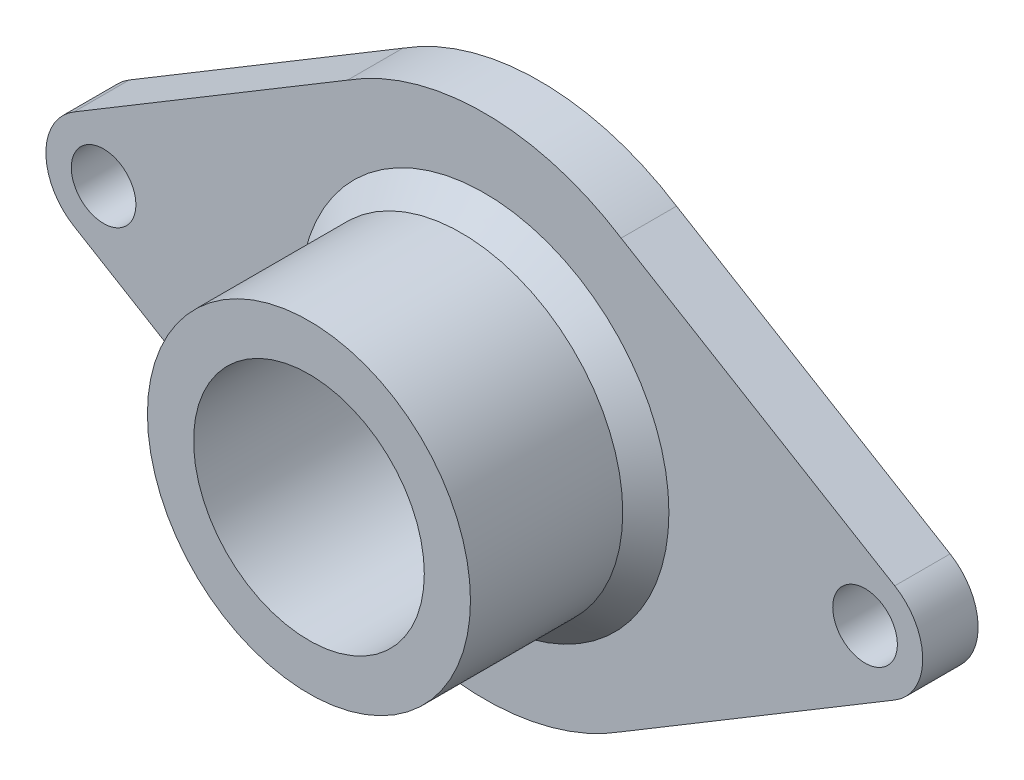
ISO-10303-21;
HEADER;
FILE_DESCRIPTION(('STEP AP214'),'2;1');
FILE_NAME('part.step','',(''),(''),'','','');
FILE_SCHEMA(('AUTOMOTIVE_DESIGN { 1 0 10303 214 1 1 1 1 }'));
ENDSEC;
DATA;
#1=APPLICATION_CONTEXT('core data for automotive mechanical design processes');
#2=APPLICATION_PROTOCOL_DEFINITION('international standard','automotive_design',2000,#1);
#3=PRODUCT_CONTEXT('',#1,'mechanical');
#4=PRODUCT('Part','Part','',(#3));
#5=PRODUCT_RELATED_PRODUCT_CATEGORY('part','',(#4));
#6=PRODUCT_DEFINITION_FORMATION('','',#4);
#7=PRODUCT_DEFINITION_CONTEXT('part definition',#1,'design');
#8=PRODUCT_DEFINITION('design','',#6,#7);
#9=PRODUCT_DEFINITION_SHAPE('','',#8);
#10=(LENGTH_UNIT() NAMED_UNIT(*) SI_UNIT(.MILLI.,.METRE.));
#11=(NAMED_UNIT(*) PLANE_ANGLE_UNIT() SI_UNIT($,.RADIAN.));
#12=(NAMED_UNIT(*) SI_UNIT($,.STERADIAN.) SOLID_ANGLE_UNIT());
#13=UNCERTAINTY_MEASURE_WITH_UNIT(LENGTH_MEASURE(1.E-05),#10,'distance_accuracy_value','');
#14=(GEOMETRIC_REPRESENTATION_CONTEXT(3) GLOBAL_UNCERTAINTY_ASSIGNED_CONTEXT((#13)) GLOBAL_UNIT_ASSIGNED_CONTEXT((#10,
#11,#12)) REPRESENTATION_CONTEXT('',''));
#15=CARTESIAN_POINT('',(0.,0.,0.));
#16=DIRECTION('',(0.,0.,1.));
#17=DIRECTION('',(1.,0.,0.));
#18=AXIS2_PLACEMENT_3D('',#15,#16,#17);
#19=CARTESIAN_POINT('',(0.,0.,50.));
#20=DIRECTION('',(0.,0.,1.));
#21=DIRECTION('',(1.,0.,0.));
#22=AXIS2_PLACEMENT_3D('',#19,#20,#21);
#23=PLANE('',#22);
#24=CARTESIAN_POINT('',(0.,0.,50.));
#25=DIRECTION('',(0.,0.,1.));
#26=DIRECTION('',(1.,0.,0.));
#27=AXIS2_PLACEMENT_3D('',#24,#25,#26);
#28=CIRCLE('',#27,35.);
#29=CARTESIAN_POINT('',(35.,0.,50.));
#30=VERTEX_POINT('',#29);
#31=EDGE_CURVE('E165',#30,#30,#28,.T.);
#32=ORIENTED_EDGE('',*,*,#31,.T.);
#33=EDGE_LOOP('',(#32));
#34=FACE_BOUND('',#33,.T.);
#35=CARTESIAN_POINT('',(0.,0.,50.));
#36=DIRECTION('',(0.,0.,1.));
#37=DIRECTION('',(1.,0.,0.));
#38=AXIS2_PLACEMENT_3D('',#35,#36,#37);
#39=CIRCLE('',#38,25.);
#40=CARTESIAN_POINT('',(25.,0.,50.));
#41=VERTEX_POINT('',#40);
#42=EDGE_CURVE('E162',#41,#41,#39,.T.);
#43=ORIENTED_EDGE('',*,*,#42,.F.);
#44=EDGE_LOOP('',(#43));
#45=FACE_BOUND('',#44,.T.);
#46=ADVANCED_FACE('F33',(#34,#45),#23,.T.);
#47=CARTESIAN_POINT('',(0.,0.,0.));
#48=DIRECTION('',(0.,0.,1.));
#49=DIRECTION('',(1.,0.,0.));
#50=AXIS2_PLACEMENT_3D('',#47,#48,#49);
#51=PLANE('',#50);
#52=CARTESIAN_POINT('',(82.5000000001048,8.88178419700125E-13,0.));
#53=DIRECTION('',(0.,0.,-1.));
#54=DIRECTION('',(-1.,0.,0.));
#55=AXIS2_PLACEMENT_3D('',#52,#53,#54);
#56=CIRCLE('',#55,7.);
#57=CARTESIAN_POINT('',(75.5000000001048,8.88178419700125E-13,0.));
#58=VERTEX_POINT('',#57);
#59=EDGE_CURVE('E355',#58,#58,#56,.T.);
#60=ORIENTED_EDGE('',*,*,#59,.F.);
#61=EDGE_LOOP('',(#60));
#62=FACE_BOUND('',#61,.T.);
#63=CARTESIAN_POINT('',(-82.5000000000336,5.24857934891543E-11,0.));
#64=DIRECTION('',(0.,0.,-1.));
#65=DIRECTION('',(-1.,0.,0.));
#66=AXIS2_PLACEMENT_3D('',#63,#64,#65);
#67=CIRCLE('',#66,7.);
#68=CARTESIAN_POINT('',(-89.5000000000336,5.24857934891543E-11,0.));
#69=VERTEX_POINT('',#68);
#70=EDGE_CURVE('E349',#69,#69,#67,.T.);
#71=ORIENTED_EDGE('',*,*,#70,.F.);
#72=EDGE_LOOP('',(#71));
#73=FACE_BOUND('',#72,.T.);
#74=CARTESIAN_POINT('',(0.,0.,0.));
#75=DIRECTION('',(0.,0.,1.));
#76=DIRECTION('',(1.,0.,0.));
#77=AXIS2_PLACEMENT_3D('',#74,#75,#76);
#78=CIRCLE('',#77,25.);
#79=CARTESIAN_POINT('',(25.,0.,0.));
#80=VERTEX_POINT('',#79);
#81=EDGE_CURVE('E161',#80,#80,#78,.T.);
#82=ORIENTED_EDGE('',*,*,#81,.T.);
#83=EDGE_LOOP('',(#82));
#84=FACE_BOUND('',#83,.T.);
#85=CARTESIAN_POINT('',(0.,0.,0.));
#86=DIRECTION('',(0.,0.,1.));
#87=DIRECTION('',(1.,0.,0.));
#88=AXIS2_PLACEMENT_3D('',#85,#86,#87);
#89=CIRCLE('',#88,55.);
#90=CARTESIAN_POINT('',(-29.647715243353,-46.3250793938775,0.));
#91=VERTEX_POINT('',#90);
#92=CARTESIAN_POINT('',(29.647715243353,-46.3250793938775,0.));
#93=VERTEX_POINT('',#92);
#94=EDGE_CURVE('E131',#91,#93,#89,.T.);
#95=ORIENTED_EDGE('',*,*,#94,.F.);
#96=DIRECTION('',(0.857261085832515,-0.514881958042091,0.));
#97=VECTOR('',#96,1.);
#98=CARTESIAN_POINT('',(-29.647715243353,-46.3250793938775,0.));
#99=LINE('',#98,#97);
#100=CARTESIAN_POINT('',(-88.936024475546,-10.7157635728622,0.));
#101=VERTEX_POINT('',#100);
#102=EDGE_CURVE('E85',#101,#91,#99,.T.);
#103=ORIENTED_EDGE('',*,*,#102,.F.);
#104=CARTESIAN_POINT('',(-82.5000000000336,5.24857934891543E-11,0.));
#105=DIRECTION('',(0.,0.,1.));
#106=DIRECTION('',(1.,0.,0.));
#107=AXIS2_PLACEMENT_3D('',#104,#105,#106);
#108=CIRCLE('',#107,12.5);
#109=CARTESIAN_POINT('',(-88.936024475546,10.7157635729672,0.));
#110=VERTEX_POINT('',#109);
#111=EDGE_CURVE('E79',#110,#101,#108,.T.);
#112=ORIENTED_EDGE('',*,*,#111,.F.);
#113=DIRECTION('',(-0.857261085833173,-0.514881958040995,0.));
#114=VECTOR('',#113,1.);
#115=CARTESIAN_POINT('',(-29.6477152433058,46.3250793939077,0.));
#116=LINE('',#115,#114);
#117=CARTESIAN_POINT('',(-29.6477152433058,46.3250793939077,0.));
#118=VERTEX_POINT('',#117);
#119=EDGE_CURVE('E121',#118,#110,#116,.T.);
#120=ORIENTED_EDGE('',*,*,#119,.F.);
#121=CARTESIAN_POINT('',(0.,0.,0.));
#122=DIRECTION('',(0.,0.,1.));
#123=DIRECTION('',(1.,0.,0.));
#124=AXIS2_PLACEMENT_3D('',#121,#122,#123);
#125=CIRCLE('',#124,55.0000000000009);
#126=CARTESIAN_POINT('',(29.6477152433086,46.325079393907,0.));
#127=VERTEX_POINT('',#126);
#128=EDGE_CURVE('E141',#127,#118,#125,.T.);
#129=ORIENTED_EDGE('',*,*,#128,.F.);
#130=DIRECTION('',(-0.857261085833173,0.514881958040996,0.));
#131=VECTOR('',#130,1.);
#132=CARTESIAN_POINT('',(29.6477152433091,46.3250793939078,0.));
#133=LINE('',#132,#131);
#134=CARTESIAN_POINT('',(88.9360244755493,10.7157635729672,0.));
#135=VERTEX_POINT('',#134);
#136=EDGE_CURVE('E139',#135,#127,#133,.T.);
#137=ORIENTED_EDGE('',*,*,#136,.F.);
#138=CARTESIAN_POINT('',(82.5000000001048,8.88178419700125E-13,0.));
#139=DIRECTION('',(0.,0.,1.));
#140=DIRECTION('',(-1.,0.,0.));
#141=AXIS2_PLACEMENT_3D('',#138,#139,#140);
#142=CIRCLE('',#141,12.5000000000084);
#143=CARTESIAN_POINT('',(88.9360244755942,-10.7157635729374,0.));
#144=VERTEX_POINT('',#143);
#145=EDGE_CURVE('E137',#144,#135,#142,.T.);
#146=ORIENTED_EDGE('',*,*,#145,.F.);
#147=DIRECTION('',(0.857261085833173,0.514881958040996,0.));
#148=VECTOR('',#147,1.);
#149=CARTESIAN_POINT('',(29.647715243353,-46.3250793938775,0.));
#150=LINE('',#149,#148);
#151=EDGE_CURVE('E134',#93,#144,#150,.T.);
#152=ORIENTED_EDGE('',*,*,#151,.F.);
#153=EDGE_LOOP('',(#95,#103,#112,#120,#129,#137,#146,#152));
#154=FACE_BOUND('',#153,.T.);
#155=ADVANCED_FACE('F186',(#62,#73,#84,#154),#51,.F.);
#156=CARTESIAN_POINT('',(0.,0.,50.));
#157=DIRECTION('',(0.,0.,-1.));
#158=DIRECTION('',(-1.,0.,0.));
#159=AXIS2_PLACEMENT_3D('',#156,#157,#158);
#160=CYLINDRICAL_SURFACE('',#159,35.);
#161=CARTESIAN_POINT('',(0.,0.,17.));
#162=DIRECTION('',(0.,0.,1.));
#163=DIRECTION('',(1.,0.,0.));
#164=AXIS2_PLACEMENT_3D('',#161,#162,#163);
#165=CIRCLE('',#164,35.);
#166=CARTESIAN_POINT('',(35.,0.,17.));
#167=VERTEX_POINT('',#166);
#168=EDGE_CURVE('E42',#167,#167,#165,.T.);
#169=ORIENTED_EDGE('',*,*,#168,.T.);
#170=EDGE_LOOP('',(#169));
#171=FACE_BOUND('',#170,.T.);
#172=ORIENTED_EDGE('',*,*,#31,.F.);
#173=EDGE_LOOP('',(#172));
#174=FACE_BOUND('',#173,.T.);
#175=ADVANCED_FACE('F172',(#171,#174),#160,.T.);
#176=CARTESIAN_POINT('',(0.,0.,50.));
#177=DIRECTION('',(0.,0.,-1.));
#178=DIRECTION('',(-1.,0.,0.));
#179=AXIS2_PLACEMENT_3D('',#176,#177,#178);
#180=CYLINDRICAL_SURFACE('',#179,25.);
#181=ORIENTED_EDGE('',*,*,#42,.T.);
#182=EDGE_LOOP('',(#181));
#183=FACE_BOUND('',#182,.T.);
#184=ORIENTED_EDGE('',*,*,#81,.F.);
#185=EDGE_LOOP('',(#184));
#186=FACE_BOUND('',#185,.T.);
#187=ADVANCED_FACE('F196',(#183,#186),#180,.F.);
#188=CARTESIAN_POINT('',(0.,0.,12.));
#189=DIRECTION('',(0.,0.,1.));
#190=DIRECTION('',(1.,0.,0.));
#191=AXIS2_PLACEMENT_3D('',#188,#189,#190);
#192=PLANE('',#191);
#193=CARTESIAN_POINT('',(0.,0.,12.));
#194=DIRECTION('',(0.,0.,1.));
#195=DIRECTION('',(1.,0.,0.));
#196=AXIS2_PLACEMENT_3D('',#193,#194,#195);
#197=CIRCLE('',#196,40.);
#198=CARTESIAN_POINT('',(40.,0.,12.));
#199=VERTEX_POINT('',#198);
#200=EDGE_CURVE('E11',#199,#199,#197,.F.);
#201=ORIENTED_EDGE('',*,*,#200,.T.);
#202=EDGE_LOOP('',(#201));
#203=FACE_BOUND('',#202,.T.);
#204=CARTESIAN_POINT('',(82.5000000001048,8.88178419700125E-13,12.));
#205=DIRECTION('',(0.,0.,-1.));
#206=DIRECTION('',(-1.,0.,0.));
#207=AXIS2_PLACEMENT_3D('',#204,#205,#206);
#208=CIRCLE('',#207,7.);
#209=CARTESIAN_POINT('',(75.5000000001048,8.88178419700125E-13,12.));
#210=VERTEX_POINT('',#209);
#211=EDGE_CURVE('E135',#210,#210,#208,.T.);
#212=ORIENTED_EDGE('',*,*,#211,.T.);
#213=EDGE_LOOP('',(#212));
#214=FACE_BOUND('',#213,.T.);
#215=CARTESIAN_POINT('',(-82.5000000000336,5.24857934891543E-11,12.));
#216=DIRECTION('',(0.,0.,-1.));
#217=DIRECTION('',(-1.,0.,0.));
#218=AXIS2_PLACEMENT_3D('',#215,#216,#217);
#219=CIRCLE('',#218,7.);
#220=CARTESIAN_POINT('',(-89.5000000000336,5.24857934891543E-11,12.));
#221=VERTEX_POINT('',#220);
#222=EDGE_CURVE('E352',#221,#221,#219,.T.);
#223=ORIENTED_EDGE('',*,*,#222,.T.);
#224=EDGE_LOOP('',(#223));
#225=FACE_BOUND('',#224,.T.);
#226=CARTESIAN_POINT('',(0.,0.,12.));
#227=DIRECTION('',(0.,0.,1.));
#228=DIRECTION('',(1.,0.,0.));
#229=AXIS2_PLACEMENT_3D('',#226,#227,#228);
#230=CIRCLE('',#229,55.);
#231=CARTESIAN_POINT('',(-29.647715243353,-46.3250793938775,12.));
#232=VERTEX_POINT('',#231);
#233=CARTESIAN_POINT('',(29.647715243353,-46.3250793938775,12.));
#234=VERTEX_POINT('',#233);
#235=EDGE_CURVE('E146',#232,#234,#230,.T.);
#236=ORIENTED_EDGE('',*,*,#235,.T.);
#237=DIRECTION('',(0.857261085833173,0.514881958040996,0.));
#238=VECTOR('',#237,1.);
#239=CARTESIAN_POINT('',(29.647715243353,-46.3250793938775,12.));
#240=LINE('',#239,#238);
#241=CARTESIAN_POINT('',(88.9360244755942,-10.7157635729374,12.));
#242=VERTEX_POINT('',#241);
#243=EDGE_CURVE('E94',#234,#242,#240,.T.);
#244=ORIENTED_EDGE('',*,*,#243,.T.);
#245=CARTESIAN_POINT('',(82.5000000001048,8.88178419700125E-13,12.));
#246=DIRECTION('',(0.,0.,1.));
#247=DIRECTION('',(-1.,0.,0.));
#248=AXIS2_PLACEMENT_3D('',#245,#246,#247);
#249=CIRCLE('',#248,12.5000000000084);
#250=CARTESIAN_POINT('',(88.9360244755493,10.7157635729672,12.));
#251=VERTEX_POINT('',#250);
#252=EDGE_CURVE('E338',#242,#251,#249,.T.);
#253=ORIENTED_EDGE('',*,*,#252,.T.);
#254=DIRECTION('',(-0.857261085833173,0.514881958040996,0.));
#255=VECTOR('',#254,1.);
#256=CARTESIAN_POINT('',(29.6477152433091,46.3250793939078,12.));
#257=LINE('',#256,#255);
#258=CARTESIAN_POINT('',(29.6477152433086,46.325079393907,12.));
#259=VERTEX_POINT('',#258);
#260=EDGE_CURVE('E343',#251,#259,#257,.T.);
#261=ORIENTED_EDGE('',*,*,#260,.T.);
#262=CARTESIAN_POINT('',(0.,0.,12.));
#263=DIRECTION('',(0.,0.,1.));
#264=DIRECTION('',(1.,0.,0.));
#265=AXIS2_PLACEMENT_3D('',#262,#263,#264);
#266=CIRCLE('',#265,55.0000000000009);
#267=CARTESIAN_POINT('',(-29.6477152433058,46.3250793939077,12.));
#268=VERTEX_POINT('',#267);
#269=EDGE_CURVE('E113',#259,#268,#266,.T.);
#270=ORIENTED_EDGE('',*,*,#269,.T.);
#271=DIRECTION('',(-0.857261085833173,-0.514881958040995,0.));
#272=VECTOR('',#271,1.);
#273=CARTESIAN_POINT('',(-29.6477152433058,46.3250793939077,12.));
#274=LINE('',#273,#272);
#275=CARTESIAN_POINT('',(-88.936024475546,10.7157635729672,12.));
#276=VERTEX_POINT('',#275);
#277=EDGE_CURVE('E107',#268,#276,#274,.T.);
#278=ORIENTED_EDGE('',*,*,#277,.T.);
#279=CARTESIAN_POINT('',(-82.5000000000336,5.24857934891543E-11,12.));
#280=DIRECTION('',(0.,0.,1.));
#281=DIRECTION('',(1.,0.,0.));
#282=AXIS2_PLACEMENT_3D('',#279,#280,#281);
#283=CIRCLE('',#282,12.5);
#284=CARTESIAN_POINT('',(-88.936024475546,-10.7157635728622,12.));
#285=VERTEX_POINT('',#284);
#286=EDGE_CURVE('E111',#276,#285,#283,.T.);
#287=ORIENTED_EDGE('',*,*,#286,.T.);
#288=DIRECTION('',(0.857261085832515,-0.514881958042091,0.));
#289=VECTOR('',#288,1.);
#290=CARTESIAN_POINT('',(-29.647715243353,-46.3250793938775,12.));
#291=LINE('',#290,#289);
#292=EDGE_CURVE('E50',#285,#232,#291,.T.);
#293=ORIENTED_EDGE('',*,*,#292,.T.);
#294=EDGE_LOOP('',(#236,#244,#253,#261,#270,#278,#287,#293));
#295=FACE_BOUND('',#294,.T.);
#296=ADVANCED_FACE('F109',(#203,#214,#225,#295),#192,.T.);
#297=CARTESIAN_POINT('',(0.,0.,12.));
#298=DIRECTION('',(0.,0.,-1.));
#299=DIRECTION('',(-1.,0.,0.));
#300=AXIS2_PLACEMENT_3D('',#297,#298,#299);
#301=CYLINDRICAL_SURFACE('',#300,55.);
#302=ORIENTED_EDGE('',*,*,#94,.T.);
#303=DIRECTION('',(0.,0.,-1.));
#304=VECTOR('',#303,1.);
#305=CARTESIAN_POINT('',(29.647715243353,-46.3250793938775,12.));
#306=LINE('',#305,#304);
#307=EDGE_CURVE('E159',#234,#93,#306,.T.);
#308=ORIENTED_EDGE('',*,*,#307,.F.);
#309=ORIENTED_EDGE('',*,*,#235,.F.);
#310=DIRECTION('',(0.,0.,-1.));
#311=VECTOR('',#310,1.);
#312=CARTESIAN_POINT('',(-29.647715243353,-46.3250793938775,12.));
#313=LINE('',#312,#311);
#314=EDGE_CURVE('E127',#232,#91,#313,.T.);
#315=ORIENTED_EDGE('',*,*,#314,.T.);
#316=EDGE_LOOP('',(#302,#308,#309,#315));
#317=FACE_BOUND('',#316,.T.);
#318=ADVANCED_FACE('F208',(#317),#301,.T.);
#319=CARTESIAN_POINT('',(29.647715243353,-46.3250793938775,12.));
#320=DIRECTION('',(-0.514881958040995,0.857261085833173,0.));
#321=DIRECTION('',(-0.857261085833173,-0.514881958040996,0.));
#322=AXIS2_PLACEMENT_3D('',#319,#320,#321);
#323=PLANE('',#322);
#324=ORIENTED_EDGE('',*,*,#151,.T.);
#325=DIRECTION('',(0.,0.,-1.));
#326=VECTOR('',#325,1.);
#327=CARTESIAN_POINT('',(88.9360244755942,-10.7157635729374,12.));
#328=LINE('',#327,#326);
#329=EDGE_CURVE('E156',#242,#144,#328,.T.);
#330=ORIENTED_EDGE('',*,*,#329,.F.);
#331=ORIENTED_EDGE('',*,*,#243,.F.);
#332=ORIENTED_EDGE('',*,*,#307,.T.);
#333=EDGE_LOOP('',(#324,#330,#331,#332));
#334=FACE_BOUND('',#333,.T.);
#335=ADVANCED_FACE('F245',(#334),#323,.F.);
#336=CARTESIAN_POINT('',(82.5000000001048,8.88178419700125E-13,12.));
#337=DIRECTION('',(0.,0.,-1.));
#338=DIRECTION('',(-1.,0.,0.));
#339=AXIS2_PLACEMENT_3D('',#336,#337,#338);
#340=CYLINDRICAL_SURFACE('',#339,12.5000000000084);
#341=ORIENTED_EDGE('',*,*,#145,.T.);
#342=DIRECTION('',(0.,0.,-1.));
#343=VECTOR('',#342,1.);
#344=CARTESIAN_POINT('',(88.9360244755493,10.7157635729672,12.));
#345=LINE('',#344,#343);
#346=EDGE_CURVE('E153',#251,#135,#345,.T.);
#347=ORIENTED_EDGE('',*,*,#346,.F.);
#348=ORIENTED_EDGE('',*,*,#252,.F.);
#349=ORIENTED_EDGE('',*,*,#329,.T.);
#350=EDGE_LOOP('',(#341,#347,#348,#349));
#351=FACE_BOUND('',#350,.T.);
#352=ADVANCED_FACE('F241',(#351),#340,.T.);
#353=CARTESIAN_POINT('',(29.6477152433091,46.3250793939078,12.));
#354=DIRECTION('',(-0.514881958040996,-0.857261085833173,0.));
#355=DIRECTION('',(0.857261085833173,-0.514881958040996,0.));
#356=AXIS2_PLACEMENT_3D('',#353,#354,#355);
#357=PLANE('',#356);
#358=ORIENTED_EDGE('',*,*,#136,.T.);
#359=DIRECTION('',(0.,0.,-1.));
#360=VECTOR('',#359,1.);
#361=CARTESIAN_POINT('',(29.6477152433086,46.325079393907,12.));
#362=LINE('',#361,#360);
#363=EDGE_CURVE('E150',#259,#127,#362,.T.);
#364=ORIENTED_EDGE('',*,*,#363,.F.);
#365=ORIENTED_EDGE('',*,*,#260,.F.);
#366=ORIENTED_EDGE('',*,*,#346,.T.);
#367=EDGE_LOOP('',(#358,#364,#365,#366));
#368=FACE_BOUND('',#367,.T.);
#369=ADVANCED_FACE('F237',(#368),#357,.F.);
#370=CARTESIAN_POINT('',(0.,0.,12.));
#371=DIRECTION('',(0.,0.,-1.));
#372=DIRECTION('',(-1.,0.,0.));
#373=AXIS2_PLACEMENT_3D('',#370,#371,#372);
#374=CYLINDRICAL_SURFACE('',#373,55.0000000000009);
#375=ORIENTED_EDGE('',*,*,#128,.T.);
#376=DIRECTION('',(0.,0.,-1.));
#377=VECTOR('',#376,1.);
#378=CARTESIAN_POINT('',(-29.6477152433058,46.3250793939077,12.));
#379=LINE('',#378,#377);
#380=EDGE_CURVE('E122',#268,#118,#379,.T.);
#381=ORIENTED_EDGE('',*,*,#380,.F.);
#382=ORIENTED_EDGE('',*,*,#269,.F.);
#383=ORIENTED_EDGE('',*,*,#363,.T.);
#384=EDGE_LOOP('',(#375,#381,#382,#383));
#385=FACE_BOUND('',#384,.T.);
#386=ADVANCED_FACE('F234',(#385),#374,.T.);
#387=CARTESIAN_POINT('',(-29.6477152433058,46.3250793939077,12.));
#388=DIRECTION('',(0.514881958040995,-0.857261085833173,0.));
#389=DIRECTION('',(0.857261085833173,0.514881958040995,0.));
#390=AXIS2_PLACEMENT_3D('',#387,#388,#389);
#391=PLANE('',#390);
#392=ORIENTED_EDGE('',*,*,#119,.T.);
#393=DIRECTION('',(0.,0.,-1.));
#394=VECTOR('',#393,1.);
#395=CARTESIAN_POINT('',(-88.936024475546,10.7157635729672,12.));
#396=LINE('',#395,#394);
#397=EDGE_CURVE('E118',#276,#110,#396,.T.);
#398=ORIENTED_EDGE('',*,*,#397,.F.);
#399=ORIENTED_EDGE('',*,*,#277,.F.);
#400=ORIENTED_EDGE('',*,*,#380,.T.);
#401=EDGE_LOOP('',(#392,#398,#399,#400));
#402=FACE_BOUND('',#401,.T.);
#403=ADVANCED_FACE('F119',(#402),#391,.F.);
#404=CARTESIAN_POINT('',(-82.5000000000336,5.24857934891543E-11,12.));
#405=DIRECTION('',(0.,0.,-1.));
#406=DIRECTION('',(-1.,0.,0.));
#407=AXIS2_PLACEMENT_3D('',#404,#405,#406);
#408=CYLINDRICAL_SURFACE('',#407,12.5);
#409=ORIENTED_EDGE('',*,*,#111,.T.);
#410=DIRECTION('',(0.,0.,-1.));
#411=VECTOR('',#410,1.);
#412=CARTESIAN_POINT('',(-88.936024475546,-10.7157635728622,12.));
#413=LINE('',#412,#411);
#414=EDGE_CURVE('E123',#285,#101,#413,.T.);
#415=ORIENTED_EDGE('',*,*,#414,.F.);
#416=ORIENTED_EDGE('',*,*,#286,.F.);
#417=ORIENTED_EDGE('',*,*,#397,.T.);
#418=EDGE_LOOP('',(#409,#415,#416,#417));
#419=FACE_BOUND('',#418,.T.);
#420=ADVANCED_FACE('F125',(#419),#408,.T.);
#421=CARTESIAN_POINT('',(-29.647715243353,-46.3250793938775,12.));
#422=DIRECTION('',(0.514881958042091,0.857261085832515,0.));
#423=DIRECTION('',(-0.857261085832515,0.514881958042091,0.));
#424=AXIS2_PLACEMENT_3D('',#421,#422,#423);
#425=PLANE('',#424);
#426=ORIENTED_EDGE('',*,*,#102,.T.);
#427=ORIENTED_EDGE('',*,*,#314,.F.);
#428=ORIENTED_EDGE('',*,*,#292,.F.);
#429=ORIENTED_EDGE('',*,*,#414,.T.);
#430=EDGE_LOOP('',(#426,#427,#428,#429));
#431=FACE_BOUND('',#430,.T.);
#432=ADVANCED_FACE('F221',(#431),#425,.F.);
#433=CARTESIAN_POINT('',(-82.5000000000336,5.24857934891543E-11,12.));
#434=DIRECTION('',(0.,0.,-1.));
#435=DIRECTION('',(-1.,0.,0.));
#436=AXIS2_PLACEMENT_3D('',#433,#434,#435);
#437=CYLINDRICAL_SURFACE('',#436,7.);
#438=ORIENTED_EDGE('',*,*,#222,.F.);
#439=EDGE_LOOP('',(#438));
#440=FACE_BOUND('',#439,.T.);
#441=ORIENTED_EDGE('',*,*,#70,.T.);
#442=EDGE_LOOP('',(#441));
#443=FACE_BOUND('',#442,.T.);
#444=ADVANCED_FACE('F181',(#440,#443),#437,.F.);
#445=CARTESIAN_POINT('',(82.5000000001048,8.88178419700125E-13,12.));
#446=DIRECTION('',(0.,0.,-1.));
#447=DIRECTION('',(-1.,0.,0.));
#448=AXIS2_PLACEMENT_3D('',#445,#446,#447);
#449=CYLINDRICAL_SURFACE('',#448,7.);
#450=ORIENTED_EDGE('',*,*,#211,.F.);
#451=EDGE_LOOP('',(#450));
#452=FACE_BOUND('',#451,.T.);
#453=ORIENTED_EDGE('',*,*,#59,.T.);
#454=EDGE_LOOP('',(#453));
#455=FACE_BOUND('',#454,.T.);
#456=ADVANCED_FACE('F176',(#452,#455),#449,.F.);
#457=CARTESIAN_POINT('',(0.,0.,17.));
#458=DIRECTION('',(0.,0.,-1.));
#459=DIRECTION('',(-1.,0.,0.));
#460=AXIS2_PLACEMENT_3D('',#457,#458,#459);
#461=CONICAL_SURFACE('',#460,35.,0.785398163397442);
#462=ORIENTED_EDGE('',*,*,#200,.F.);
#463=EDGE_LOOP('',(#462));
#464=FACE_BOUND('',#463,.T.);
#465=ORIENTED_EDGE('',*,*,#168,.F.);
#466=EDGE_LOOP('',(#465));
#467=FACE_BOUND('',#466,.T.);
#468=ADVANCED_FACE('F35',(#464,#467),#461,.T.);
#469=CLOSED_SHELL('',(#46,#155,#175,#187,#296,#318,#335,#352,#369,#386,#403,#420,#432,#444,#456,#468));
#470=MANIFOLD_SOLID_BREP('B2',#469);
#471=ADVANCED_BREP_SHAPE_REPRESENTATION('',(#18,#470),#14);
#472=SHAPE_DEFINITION_REPRESENTATION(#9,#471);
ENDSEC;
END-ISO-10303-21;
